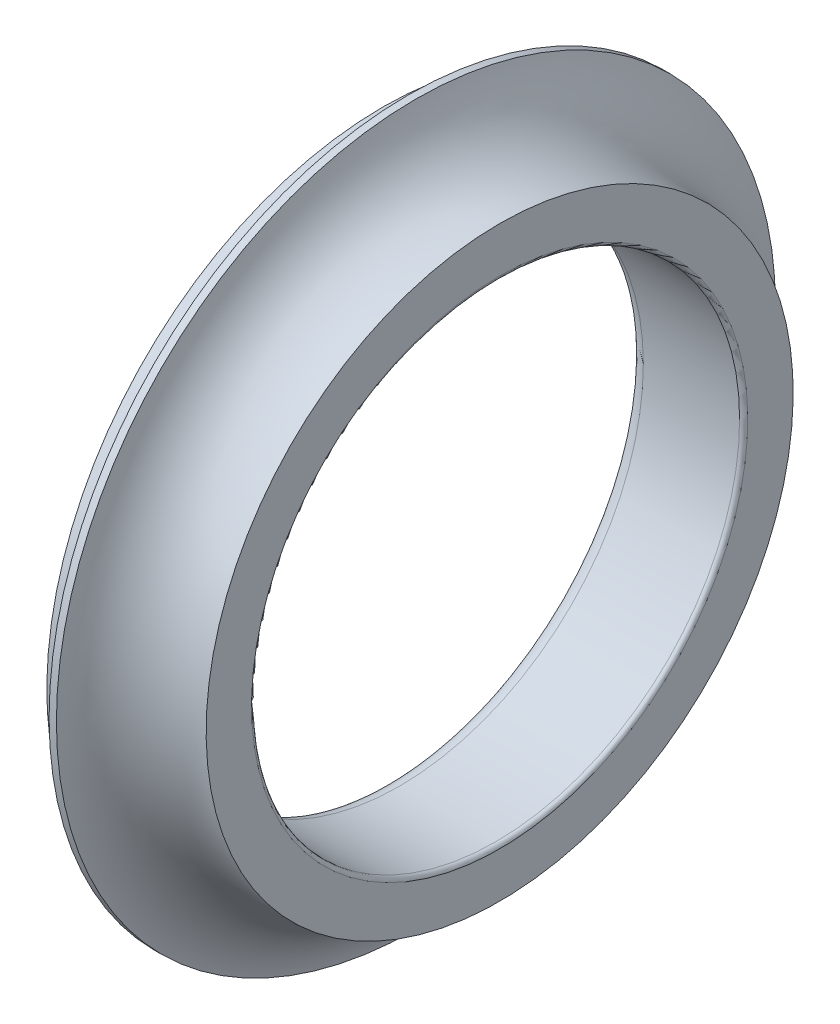
ISO-10303-21;
HEADER;
FILE_DESCRIPTION(('STEP AP214'),'2;1');
FILE_NAME('part.step','',(''),(''),'','','');
FILE_SCHEMA(('AUTOMOTIVE_DESIGN { 1 0 10303 214 1 1 1 1 }'));
ENDSEC;
DATA;
#1=APPLICATION_CONTEXT('core data for automotive mechanical design processes');
#2=APPLICATION_PROTOCOL_DEFINITION('international standard','automotive_design',2000,#1);
#3=PRODUCT_CONTEXT('',#1,'mechanical');
#4=PRODUCT('Part','Part','',(#3));
#5=PRODUCT_RELATED_PRODUCT_CATEGORY('part','',(#4));
#6=PRODUCT_DEFINITION_FORMATION('','',#4);
#7=PRODUCT_DEFINITION_CONTEXT('part definition',#1,'design');
#8=PRODUCT_DEFINITION('design','',#6,#7);
#9=PRODUCT_DEFINITION_SHAPE('','',#8);
#10=(LENGTH_UNIT() NAMED_UNIT(*) SI_UNIT(.MILLI.,.METRE.));
#11=(NAMED_UNIT(*) PLANE_ANGLE_UNIT() SI_UNIT($,.RADIAN.));
#12=(NAMED_UNIT(*) SI_UNIT($,.STERADIAN.) SOLID_ANGLE_UNIT());
#13=UNCERTAINTY_MEASURE_WITH_UNIT(LENGTH_MEASURE(1.E-05),#10,'distance_accuracy_value','');
#14=(GEOMETRIC_REPRESENTATION_CONTEXT(3) GLOBAL_UNCERTAINTY_ASSIGNED_CONTEXT((#13)) GLOBAL_UNIT_ASSIGNED_CONTEXT((#10,
#11,#12)) REPRESENTATION_CONTEXT('',''));
#15=CARTESIAN_POINT('',(0.,0.,0.));
#16=DIRECTION('',(0.,0.,1.));
#17=DIRECTION('',(1.,0.,0.));
#18=AXIS2_PLACEMENT_3D('',#15,#16,#17);
#19=CARTESIAN_POINT('',(21.5,0.,0.));
#20=DIRECTION('',(1.,0.,0.));
#21=DIRECTION('',(0.,0.,-1.));
#22=AXIS2_PLACEMENT_3D('',#19,#20,#21);
#23=TOROIDAL_SURFACE('',#22,70.,15.875);
#24=CARTESIAN_POINT('',(6.0622014198915,0.,0.));
#25=DIRECTION('',(1.,0.,0.));
#26=DIRECTION('',(0.,1.,0.));
#27=AXIS2_PLACEMENT_3D('',#24,#25,#26);
#28=CIRCLE('',#27,66.3);
#29=CARTESIAN_POINT('',(6.0622014198915,66.3,0.));
#30=VERTEX_POINT('',#29);
#31=EDGE_CURVE('E11',#30,#30,#28,.T.);
#32=ORIENTED_EDGE('',*,*,#31,.T.);
#33=EDGE_LOOP('',(#32));
#34=FACE_BOUND('',#33,.T.);
#35=CARTESIAN_POINT('',(21.5,0.,0.));
#36=DIRECTION('',(1.,0.,0.));
#37=DIRECTION('',(0.,1.,0.));
#38=AXIS2_PLACEMENT_3D('',#35,#36,#37);
#39=CIRCLE('',#38,54.125);
#40=CARTESIAN_POINT('',(21.5,54.125,0.));
#41=VERTEX_POINT('',#40);
#42=EDGE_CURVE('E54',#41,#41,#39,.T.);
#43=ORIENTED_EDGE('',*,*,#42,.F.);
#44=EDGE_LOOP('',(#43));
#45=FACE_BOUND('',#44,.T.);
#46=ADVANCED_FACE('F16',(#34,#45),#23,.F.);
#47=CARTESIAN_POINT('',(5.38723582198453,0.,0.));
#48=DIRECTION('',(-1.,0.,0.));
#49=DIRECTION('',(0.,1.,0.));
#50=AXIS2_PLACEMENT_3D('',#47,#48,#49);
#51=CYLINDRICAL_SURFACE('',#50,66.3);
#52=CARTESIAN_POINT('',(4.71227022407755,0.,0.));
#53=DIRECTION('',(1.,0.,0.));
#54=DIRECTION('',(0.,1.,0.));
#55=AXIS2_PLACEMENT_3D('',#52,#53,#54);
#56=CIRCLE('',#55,66.3);
#57=CARTESIAN_POINT('',(4.71227022407755,66.3,0.));
#58=VERTEX_POINT('',#57);
#59=EDGE_CURVE('E25',#58,#58,#56,.T.);
#60=ORIENTED_EDGE('',*,*,#59,.T.);
#61=EDGE_LOOP('',(#60));
#62=FACE_BOUND('',#61,.T.);
#63=ORIENTED_EDGE('',*,*,#31,.F.);
#64=EDGE_LOOP('',(#63));
#65=FACE_BOUND('',#64,.T.);
#66=ADVANCED_FACE('F96',(#62,#65),#51,.T.);
#67=CARTESIAN_POINT('',(4.4898034465269,0.,0.));
#68=DIRECTION('',(1.,0.,0.));
#69=DIRECTION('',(0.,1.,0.));
#70=AXIS2_PLACEMENT_3D('',#67,#68,#69);
#71=CONICAL_SURFACE('',#70,65.0383282090081,1.39626340159546);
#72=CARTESIAN_POINT('',(4.26733666897625,0.,0.));
#73=DIRECTION('',(1.,0.,0.));
#74=DIRECTION('',(0.,1.,0.));
#75=AXIS2_PLACEMENT_3D('',#72,#73,#74);
#76=CIRCLE('',#75,63.7766564180161);
#77=CARTESIAN_POINT('',(4.26733666897625,63.7766564180161,0.));
#78=VERTEX_POINT('',#77);
#79=EDGE_CURVE('E67',#78,#78,#76,.T.);
#80=ORIENTED_EDGE('',*,*,#79,.T.);
#81=EDGE_LOOP('',(#80));
#82=FACE_BOUND('',#81,.T.);
#83=ORIENTED_EDGE('',*,*,#59,.F.);
#84=EDGE_LOOP('',(#83));
#85=FACE_BOUND('',#84,.T.);
#86=ADVANCED_FACE('F101',(#82,#85),#71,.T.);
#87=CARTESIAN_POINT('',(2.15,0.,0.));
#88=DIRECTION('',(1.,0.,0.));
#89=DIRECTION('',(0.,0.,-1.));
#90=AXIS2_PLACEMENT_3D('',#87,#88,#89);
#91=TOROIDAL_SURFACE('',#90,64.15,2.15);
#92=CARTESIAN_POINT('',(2.15,0.,0.));
#93=DIRECTION('',(1.,0.,0.));
#94=DIRECTION('',(0.,1.,0.));
#95=AXIS2_PLACEMENT_3D('',#92,#93,#94);
#96=CIRCLE('',#95,62.);
#97=CARTESIAN_POINT('',(2.15,62.,0.));
#98=VERTEX_POINT('',#97);
#99=EDGE_CURVE('E69',#98,#98,#96,.T.);
#100=ORIENTED_EDGE('',*,*,#99,.T.);
#101=EDGE_LOOP('',(#100));
#102=FACE_BOUND('',#101,.T.);
#103=ORIENTED_EDGE('',*,*,#79,.F.);
#104=EDGE_LOOP('',(#103));
#105=FACE_BOUND('',#104,.T.);
#106=ADVANCED_FACE('F106',(#102,#105),#91,.F.);
#107=CARTESIAN_POINT('',(1.075,0.,0.));
#108=DIRECTION('',(-1.,0.,0.));
#109=DIRECTION('',(0.,1.,0.));
#110=AXIS2_PLACEMENT_3D('',#107,#108,#109);
#111=CYLINDRICAL_SURFACE('',#110,62.);
#112=CARTESIAN_POINT('',(0.,0.,0.));
#113=DIRECTION('',(1.,0.,0.));
#114=DIRECTION('',(0.,1.,0.));
#115=AXIS2_PLACEMENT_3D('',#112,#113,#114);
#116=CIRCLE('',#115,62.);
#117=CARTESIAN_POINT('',(0.,62.,0.));
#118=VERTEX_POINT('',#117);
#119=EDGE_CURVE('E71',#118,#118,#116,.T.);
#120=ORIENTED_EDGE('',*,*,#119,.T.);
#121=EDGE_LOOP('',(#120));
#122=FACE_BOUND('',#121,.T.);
#123=ORIENTED_EDGE('',*,*,#99,.F.);
#124=EDGE_LOOP('',(#123));
#125=FACE_BOUND('',#124,.T.);
#126=ADVANCED_FACE('F111',(#122,#125),#111,.T.);
#127=CARTESIAN_POINT('',(0.,55.,0.));
#128=DIRECTION('',(-1.,0.,0.));
#129=DIRECTION('',(0.,-1.,0.));
#130=AXIS2_PLACEMENT_3D('',#127,#128,#129);
#131=PLANE('',#130);
#132=CARTESIAN_POINT('',(0.,0.,0.));
#133=DIRECTION('',(1.,0.,0.));
#134=DIRECTION('',(0.,1.,0.));
#135=AXIS2_PLACEMENT_3D('',#132,#133,#134);
#136=CIRCLE('',#135,48.);
#137=CARTESIAN_POINT('',(0.,48.,0.));
#138=VERTEX_POINT('',#137);
#139=EDGE_CURVE('E70',#138,#138,#136,.T.);
#140=ORIENTED_EDGE('',*,*,#139,.T.);
#141=EDGE_LOOP('',(#140));
#142=FACE_BOUND('',#141,.T.);
#143=ORIENTED_EDGE('',*,*,#119,.F.);
#144=EDGE_LOOP('',(#143));
#145=FACE_BOUND('',#144,.T.);
#146=ADVANCED_FACE('F18',(#142,#145),#131,.T.);
#147=CARTESIAN_POINT('',(3.,0.,0.));
#148=DIRECTION('',(1.,0.,0.));
#149=DIRECTION('',(0.,0.,-1.));
#150=AXIS2_PLACEMENT_3D('',#147,#148,#149);
#151=TOROIDAL_SURFACE('',#150,48.,3.);
#152=CARTESIAN_POINT('',(3.,0.,0.));
#153=DIRECTION('',(1.,0.,0.));
#154=DIRECTION('',(0.,1.,0.));
#155=AXIS2_PLACEMENT_3D('',#152,#153,#154);
#156=CIRCLE('',#155,45.);
#157=CARTESIAN_POINT('',(3.,45.,0.));
#158=VERTEX_POINT('',#157);
#159=EDGE_CURVE('E61',#158,#158,#156,.T.);
#160=ORIENTED_EDGE('',*,*,#159,.T.);
#161=EDGE_LOOP('',(#160));
#162=FACE_BOUND('',#161,.T.);
#163=ORIENTED_EDGE('',*,*,#139,.F.);
#164=EDGE_LOOP('',(#163));
#165=FACE_BOUND('',#164,.T.);
#166=ADVANCED_FACE('F77',(#162,#165),#151,.T.);
#167=CARTESIAN_POINT('',(11.875,0.,0.));
#168=DIRECTION('',(-1.,0.,0.));
#169=DIRECTION('',(0.,1.,0.));
#170=AXIS2_PLACEMENT_3D('',#167,#168,#169);
#171=CYLINDRICAL_SURFACE('',#170,45.);
#172=CARTESIAN_POINT('',(20.75,0.,0.));
#173=DIRECTION('',(1.,0.,0.));
#174=DIRECTION('',(0.,1.,0.));
#175=AXIS2_PLACEMENT_3D('',#172,#173,#174);
#176=CIRCLE('',#175,45.);
#177=CARTESIAN_POINT('',(20.75,45.,0.));
#178=VERTEX_POINT('',#177);
#179=EDGE_CURVE('E58',#178,#178,#176,.T.);
#180=ORIENTED_EDGE('',*,*,#179,.T.);
#181=EDGE_LOOP('',(#180));
#182=FACE_BOUND('',#181,.T.);
#183=ORIENTED_EDGE('',*,*,#159,.F.);
#184=EDGE_LOOP('',(#183));
#185=FACE_BOUND('',#184,.T.);
#186=ADVANCED_FACE('F80',(#182,#185),#171,.F.);
#187=CARTESIAN_POINT('',(20.75,0.,0.));
#188=DIRECTION('',(1.,0.,0.));
#189=DIRECTION('',(0.,0.,-1.));
#190=AXIS2_PLACEMENT_3D('',#187,#188,#189);
#191=TOROIDAL_SURFACE('',#190,45.75,0.75);
#192=CARTESIAN_POINT('',(21.5,0.,0.));
#193=DIRECTION('',(1.,0.,0.));
#194=DIRECTION('',(0.,1.,0.));
#195=AXIS2_PLACEMENT_3D('',#192,#193,#194);
#196=CIRCLE('',#195,45.75);
#197=CARTESIAN_POINT('',(21.5,45.75,0.));
#198=VERTEX_POINT('',#197);
#199=EDGE_CURVE('E59',#198,#198,#196,.T.);
#200=ORIENTED_EDGE('',*,*,#199,.T.);
#201=EDGE_LOOP('',(#200));
#202=FACE_BOUND('',#201,.T.);
#203=ORIENTED_EDGE('',*,*,#179,.F.);
#204=EDGE_LOOP('',(#203));
#205=FACE_BOUND('',#204,.T.);
#206=ADVANCED_FACE('F82',(#202,#205),#191,.T.);
#207=CARTESIAN_POINT('',(21.5,49.9375,0.));
#208=DIRECTION('',(1.,0.,0.));
#209=DIRECTION('',(0.,1.,0.));
#210=AXIS2_PLACEMENT_3D('',#207,#208,#209);
#211=PLANE('',#210);
#212=ORIENTED_EDGE('',*,*,#42,.T.);
#213=EDGE_LOOP('',(#212));
#214=FACE_BOUND('',#213,.T.);
#215=ORIENTED_EDGE('',*,*,#199,.F.);
#216=EDGE_LOOP('',(#215));
#217=FACE_BOUND('',#216,.T.);
#218=ADVANCED_FACE('F55',(#214,#217),#211,.T.);
#219=CLOSED_SHELL('',(#46,#66,#86,#106,#126,#146,#166,#186,#206,#218));
#220=MANIFOLD_SOLID_BREP('B1',#219);
#221=ADVANCED_BREP_SHAPE_REPRESENTATION('',(#18,#220),#14);
#222=SHAPE_DEFINITION_REPRESENTATION(#9,#221);
ENDSEC;
END-ISO-10303-21;
